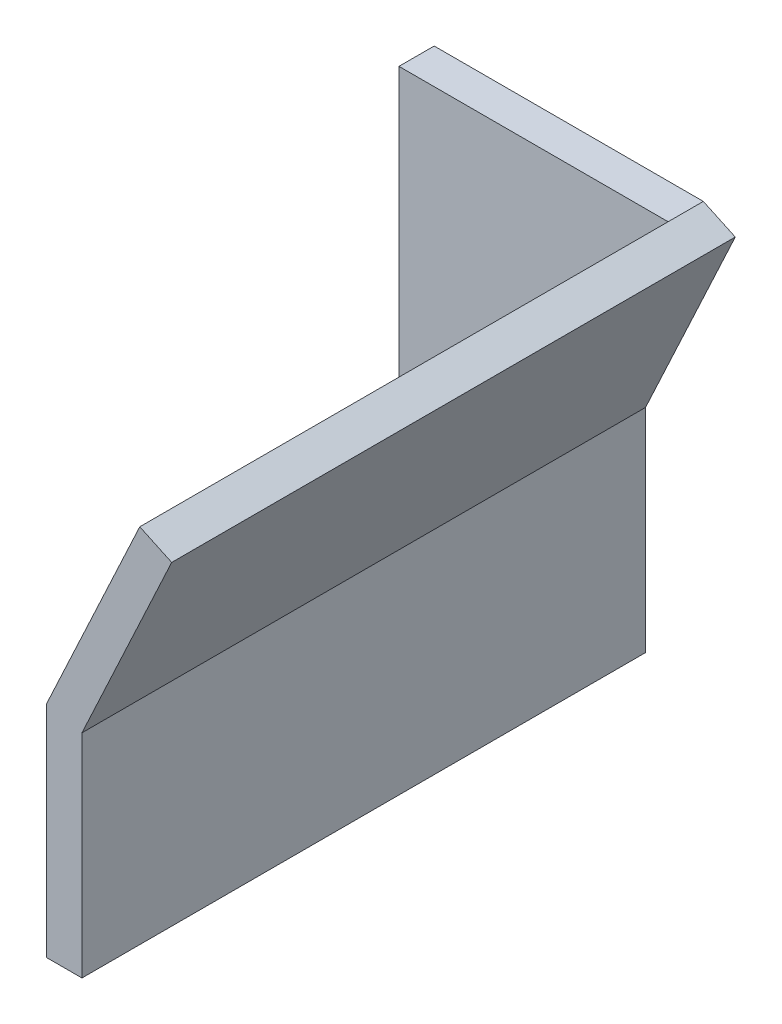
ISO-10303-21;
HEADER;
FILE_DESCRIPTION(('STEP AP214'),'2;1');
FILE_NAME('part.step','',(''),(''),'','','');
FILE_SCHEMA(('AUTOMOTIVE_DESIGN { 1 0 10303 214 1 1 1 1 }'));
ENDSEC;
DATA;
#1=APPLICATION_CONTEXT('core data for automotive mechanical design processes');
#2=APPLICATION_PROTOCOL_DEFINITION('international standard','automotive_design',2000,#1);
#3=PRODUCT_CONTEXT('',#1,'mechanical');
#4=PRODUCT('Part','Part','',(#3));
#5=PRODUCT_RELATED_PRODUCT_CATEGORY('part','',(#4));
#6=PRODUCT_DEFINITION_FORMATION('','',#4);
#7=PRODUCT_DEFINITION_CONTEXT('part definition',#1,'design');
#8=PRODUCT_DEFINITION('design','',#6,#7);
#9=PRODUCT_DEFINITION_SHAPE('','',#8);
#10=(LENGTH_UNIT() NAMED_UNIT(*) SI_UNIT(.MILLI.,.METRE.));
#11=(NAMED_UNIT(*) PLANE_ANGLE_UNIT() SI_UNIT($,.RADIAN.));
#12=(NAMED_UNIT(*) SI_UNIT($,.STERADIAN.) SOLID_ANGLE_UNIT());
#13=UNCERTAINTY_MEASURE_WITH_UNIT(LENGTH_MEASURE(1.E-05),#10,'distance_accuracy_value','');
#14=(GEOMETRIC_REPRESENTATION_CONTEXT(3) GLOBAL_UNCERTAINTY_ASSIGNED_CONTEXT((#13)) GLOBAL_UNIT_ASSIGNED_CONTEXT((#10,
#11,#12)) REPRESENTATION_CONTEXT('',''));
#15=CARTESIAN_POINT('',(0.,0.,0.));
#16=DIRECTION('',(0.,0.,1.));
#17=DIRECTION('',(1.,0.,0.));
#18=AXIS2_PLACEMENT_3D('',#15,#16,#17);
#19=CARTESIAN_POINT('',(0.,0.,60.));
#20=DIRECTION('',(1.,0.,0.));
#21=DIRECTION('',(0.,1.,0.));
#22=AXIS2_PLACEMENT_3D('',#19,#20,#21);
#23=PLANE('',#22);
#24=DIRECTION('',(0.,-1.,0.));
#25=VECTOR('',#24,1.);
#26=CARTESIAN_POINT('',(0.,0.,-60.));
#27=LINE('',#26,#25);
#28=CARTESIAN_POINT('',(0.,0.,-60.));
#29=VERTEX_POINT('',#28);
#30=CARTESIAN_POINT('',(0.,-50.,-60.));
#31=VERTEX_POINT('',#30);
#32=EDGE_CURVE('E172',#29,#31,#27,.T.);
#33=ORIENTED_EDGE('',*,*,#32,.T.);
#34=DIRECTION('',(0.,0.,-1.));
#35=VECTOR('',#34,1.);
#36=CARTESIAN_POINT('',(0.,-50.,60.));
#37=LINE('',#36,#35);
#38=CARTESIAN_POINT('',(0.,-50.,60.));
#39=VERTEX_POINT('',#38);
#40=EDGE_CURVE('E11',#39,#31,#37,.T.);
#41=ORIENTED_EDGE('',*,*,#40,.F.);
#42=DIRECTION('',(0.,-1.,0.));
#43=VECTOR('',#42,1.);
#44=CARTESIAN_POINT('',(0.,0.,60.));
#45=LINE('',#44,#43);
#46=CARTESIAN_POINT('',(0.,0.,60.));
#47=VERTEX_POINT('',#46);
#48=EDGE_CURVE('E173',#47,#39,#45,.T.);
#49=ORIENTED_EDGE('',*,*,#48,.F.);
#50=DIRECTION('',(0.,0.,-1.));
#51=VECTOR('',#50,1.);
#52=CARTESIAN_POINT('',(0.,0.,60.));
#53=LINE('',#52,#51);
#54=EDGE_CURVE('E190',#47,#29,#53,.T.);
#55=ORIENTED_EDGE('',*,*,#54,.T.);
#56=EDGE_LOOP('',(#33,#41,#49,#55));
#57=FACE_BOUND('',#56,.T.);
#58=ADVANCED_FACE('F47',(#57),#23,.F.);
#59=CARTESIAN_POINT('',(0.,-50.,60.));
#60=DIRECTION('',(0.,1.,0.));
#61=DIRECTION('',(0.,0.,1.));
#62=AXIS2_PLACEMENT_3D('',#59,#60,#61);
#63=PLANE('',#62);
#64=ORIENTED_EDGE('',*,*,#40,.T.);
#65=DIRECTION('',(-1.,0.,0.));
#66=VECTOR('',#65,1.);
#67=CARTESIAN_POINT('',(0.,-50.,-60.));
#68=LINE('',#67,#66);
#69=CARTESIAN_POINT('',(-40.,-50.,-60.));
#70=VERTEX_POINT('',#69);
#71=EDGE_CURVE('E156',#31,#70,#68,.T.);
#72=ORIENTED_EDGE('',*,*,#71,.T.);
#73=DIRECTION('',(0.,0.,1.));
#74=VECTOR('',#73,1.);
#75=CARTESIAN_POINT('',(-40.,-50.,-68.));
#76=LINE('',#75,#74);
#77=CARTESIAN_POINT('',(-40.,-50.,-68.));
#78=VERTEX_POINT('',#77);
#79=EDGE_CURVE('E168',#78,#70,#76,.T.);
#80=ORIENTED_EDGE('',*,*,#79,.F.);
#81=DIRECTION('',(-1.,0.,0.));
#82=VECTOR('',#81,1.);
#83=CARTESIAN_POINT('',(8.00000000000001,-50.,-68.));
#84=LINE('',#83,#82);
#85=CARTESIAN_POINT('',(8.00000000000001,-50.,-68.));
#86=VERTEX_POINT('',#85);
#87=EDGE_CURVE('E131',#86,#78,#84,.T.);
#88=ORIENTED_EDGE('',*,*,#87,.F.);
#89=DIRECTION('',(0.,0.,-1.));
#90=VECTOR('',#89,1.);
#91=CARTESIAN_POINT('',(8.00000000000001,-50.,60.));
#92=LINE('',#91,#90);
#93=CARTESIAN_POINT('',(8.00000000000001,-50.,60.));
#94=VERTEX_POINT('',#93);
#95=EDGE_CURVE('E56',#94,#86,#92,.T.);
#96=ORIENTED_EDGE('',*,*,#95,.F.);
#97=DIRECTION('',(1.,0.,0.));
#98=VECTOR('',#97,1.);
#99=CARTESIAN_POINT('',(0.,-50.,60.));
#100=LINE('',#99,#98);
#101=EDGE_CURVE('E176',#39,#94,#100,.T.);
#102=ORIENTED_EDGE('',*,*,#101,.F.);
#103=EDGE_LOOP('',(#64,#72,#80,#88,#96,#102));
#104=FACE_BOUND('',#103,.T.);
#105=ADVANCED_FACE('F214',(#104),#63,.F.);
#106=CARTESIAN_POINT('',(8.,-1.77355730114349,60.));
#107=DIRECTION('',(-1.,0.,0.));
#108=DIRECTION('',(0.,-1.,0.));
#109=AXIS2_PLACEMENT_3D('',#106,#107,#108);
#110=PLANE('',#109);
#111=ORIENTED_EDGE('',*,*,#95,.T.);
#112=DIRECTION('',(0.,-1.,0.));
#113=VECTOR('',#112,1.);
#114=CARTESIAN_POINT('',(8.,-1.77355730114349,-68.));
#115=LINE('',#114,#113);
#116=CARTESIAN_POINT('',(8.,-1.77355730114349,-68.));
#117=VERTEX_POINT('',#116);
#118=EDGE_CURVE('E125',#117,#86,#115,.T.);
#119=ORIENTED_EDGE('',*,*,#118,.F.);
#120=DIRECTION('',(0.,0.,-1.));
#121=VECTOR('',#120,1.);
#122=CARTESIAN_POINT('',(8.,-1.77355730114349,60.));
#123=LINE('',#122,#121);
#124=CARTESIAN_POINT('',(8.,-1.77355730114349,60.));
#125=VERTEX_POINT('',#124);
#126=EDGE_CURVE('E112',#125,#117,#123,.T.);
#127=ORIENTED_EDGE('',*,*,#126,.F.);
#128=DIRECTION('',(0.,1.,0.));
#129=VECTOR('',#128,1.);
#130=CARTESIAN_POINT('',(8.,-1.77355730114349,60.));
#131=LINE('',#130,#129);
#132=EDGE_CURVE('E180',#94,#125,#131,.T.);
#133=ORIENTED_EDGE('',*,*,#132,.F.);
#134=EDGE_LOOP('',(#111,#119,#127,#133));
#135=FACE_BOUND('',#134,.T.);
#136=ADVANCED_FACE('F126',(#135),#110,.F.);
#137=CARTESIAN_POINT('',(8.,-1.77355730114349,60.));
#138=DIRECTION('',(-0.906307787036653,0.422618261740694,0.));
#139=DIRECTION('',(-0.422618261740694,-0.906307787036653,0.));
#140=AXIS2_PLACEMENT_3D('',#137,#138,#139);
#141=PLANE('',#140);
#142=ORIENTED_EDGE('',*,*,#126,.T.);
#143=DIRECTION('',(-0.422618261740694,-0.906307787036653,0.));
#144=VECTOR('',#143,1.);
#145=CARTESIAN_POINT('',(28.3813753833279,41.9344432579071,-68.));
#146=LINE('',#145,#144);
#147=CARTESIAN_POINT('',(28.3813753833279,41.9344432579071,-68.));
#148=VERTEX_POINT('',#147);
#149=EDGE_CURVE('E117',#148,#117,#146,.T.);
#150=ORIENTED_EDGE('',*,*,#149,.F.);
#151=DIRECTION('',(0.,0.,-1.));
#152=VECTOR('',#151,1.);
#153=CARTESIAN_POINT('',(28.3813753833279,41.9344432579071,60.));
#154=LINE('',#153,#152);
#155=CARTESIAN_POINT('',(28.3813753833279,41.9344432579071,60.));
#156=VERTEX_POINT('',#155);
#157=EDGE_CURVE('E122',#156,#148,#154,.T.);
#158=ORIENTED_EDGE('',*,*,#157,.F.);
#159=DIRECTION('',(0.422618261740694,0.906307787036653,0.));
#160=VECTOR('',#159,1.);
#161=CARTESIAN_POINT('',(8.,-1.77355730114349,60.));
#162=LINE('',#161,#160);
#163=EDGE_CURVE('E118',#125,#156,#162,.T.);
#164=ORIENTED_EDGE('',*,*,#163,.F.);
#165=EDGE_LOOP('',(#142,#150,#158,#164));
#166=FACE_BOUND('',#165,.T.);
#167=ADVANCED_FACE('F114',(#166),#141,.F.);
#168=CARTESIAN_POINT('',(21.1309130870347,45.3153893518326,60.));
#169=DIRECTION('',(-0.422618261740694,-0.906307787036653,0.));
#170=DIRECTION('',(0.906307787036653,-0.422618261740694,0.));
#171=AXIS2_PLACEMENT_3D('',#168,#169,#170);
#172=PLANE('',#171);
#173=ORIENTED_EDGE('',*,*,#157,.T.);
#174=DIRECTION('',(0.906307787036653,-0.422618261740694,0.));
#175=VECTOR('',#174,1.);
#176=CARTESIAN_POINT('',(28.3813753833279,41.9344432579071,-68.));
#177=LINE('',#176,#175);
#178=CARTESIAN_POINT('',(21.1309130870347,45.3153893518326,-68.));
#179=VERTEX_POINT('',#178);
#180=EDGE_CURVE('E136',#179,#148,#177,.T.);
#181=ORIENTED_EDGE('',*,*,#180,.F.);
#182=DIRECTION('',(0.,0.,1.));
#183=VECTOR('',#182,1.);
#184=CARTESIAN_POINT('',(21.1309130870347,45.3153893518326,-68.));
#185=LINE('',#184,#183);
#186=CARTESIAN_POINT('',(21.1309130870347,45.3153893518326,-60.));
#187=VERTEX_POINT('',#186);
#188=EDGE_CURVE('E155',#179,#187,#185,.T.);
#189=ORIENTED_EDGE('',*,*,#188,.T.);
#190=DIRECTION('',(0.,0.,-1.));
#191=VECTOR('',#190,1.);
#192=CARTESIAN_POINT('',(21.1309130870347,45.3153893518326,60.));
#193=LINE('',#192,#191);
#194=CARTESIAN_POINT('',(21.1309130870347,45.3153893518326,60.));
#195=VERTEX_POINT('',#194);
#196=EDGE_CURVE('E200',#195,#187,#193,.T.);
#197=ORIENTED_EDGE('',*,*,#196,.F.);
#198=DIRECTION('',(-0.906307787036653,0.422618261740694,0.));
#199=VECTOR('',#198,1.);
#200=CARTESIAN_POINT('',(21.1309130870347,45.3153893518326,60.));
#201=LINE('',#200,#199);
#202=EDGE_CURVE('E185',#156,#195,#201,.T.);
#203=ORIENTED_EDGE('',*,*,#202,.F.);
#204=EDGE_LOOP('',(#173,#181,#189,#197,#203));
#205=FACE_BOUND('',#204,.T.);
#206=ADVANCED_FACE('F208',(#205),#172,.F.);
#207=CARTESIAN_POINT('',(0.,0.,60.));
#208=DIRECTION('',(0.906307787036653,-0.422618261740694,0.));
#209=DIRECTION('',(0.422618261740694,0.906307787036653,0.));
#210=AXIS2_PLACEMENT_3D('',#207,#208,#209);
#211=PLANE('',#210);
#212=DIRECTION('',(-0.422618261740694,-0.906307787036653,0.));
#213=VECTOR('',#212,1.);
#214=CARTESIAN_POINT('',(0.,0.,-60.));
#215=LINE('',#214,#213);
#216=EDGE_CURVE('E177',#187,#29,#215,.T.);
#217=ORIENTED_EDGE('',*,*,#216,.T.);
#218=ORIENTED_EDGE('',*,*,#54,.F.);
#219=DIRECTION('',(-0.422618261740694,-0.906307787036653,0.));
#220=VECTOR('',#219,1.);
#221=CARTESIAN_POINT('',(0.,0.,60.));
#222=LINE('',#221,#220);
#223=EDGE_CURVE('E63',#195,#47,#222,.T.);
#224=ORIENTED_EDGE('',*,*,#223,.F.);
#225=ORIENTED_EDGE('',*,*,#196,.T.);
#226=EDGE_LOOP('',(#217,#218,#224,#225));
#227=FACE_BOUND('',#226,.T.);
#228=ADVANCED_FACE('F227',(#227),#211,.F.);
#229=CARTESIAN_POINT('',(0.,0.,60.));
#230=DIRECTION('',(0.,0.,1.));
#231=DIRECTION('',(1.,0.,0.));
#232=AXIS2_PLACEMENT_3D('',#229,#230,#231);
#233=PLANE('',#232);
#234=ORIENTED_EDGE('',*,*,#48,.T.);
#235=ORIENTED_EDGE('',*,*,#101,.T.);
#236=ORIENTED_EDGE('',*,*,#132,.T.);
#237=ORIENTED_EDGE('',*,*,#163,.T.);
#238=ORIENTED_EDGE('',*,*,#202,.T.);
#239=ORIENTED_EDGE('',*,*,#223,.T.);
#240=EDGE_LOOP('',(#234,#235,#236,#237,#238,#239));
#241=FACE_BOUND('',#240,.T.);
#242=ADVANCED_FACE('F210',(#241),#233,.T.);
#243=CARTESIAN_POINT('',(-40.,-50.,-68.));
#244=DIRECTION('',(1.,0.,0.));
#245=DIRECTION('',(0.,0.,-1.));
#246=AXIS2_PLACEMENT_3D('',#243,#244,#245);
#247=PLANE('',#246);
#248=DIRECTION('',(0.,1.,0.));
#249=VECTOR('',#248,1.);
#250=CARTESIAN_POINT('',(-40.,-50.,-60.));
#251=LINE('',#250,#249);
#252=CARTESIAN_POINT('',(-40.,45.3153893518326,-60.));
#253=VERTEX_POINT('',#252);
#254=EDGE_CURVE('E142',#70,#253,#251,.T.);
#255=ORIENTED_EDGE('',*,*,#254,.T.);
#256=DIRECTION('',(0.,0.,1.));
#257=VECTOR('',#256,1.);
#258=CARTESIAN_POINT('',(-40.,45.3153893518326,-68.));
#259=LINE('',#258,#257);
#260=CARTESIAN_POINT('',(-40.,45.3153893518326,-68.));
#261=VERTEX_POINT('',#260);
#262=EDGE_CURVE('E164',#261,#253,#259,.T.);
#263=ORIENTED_EDGE('',*,*,#262,.F.);
#264=DIRECTION('',(0.,1.,0.));
#265=VECTOR('',#264,1.);
#266=CARTESIAN_POINT('',(-40.,-50.,-68.));
#267=LINE('',#266,#265);
#268=EDGE_CURVE('E147',#78,#261,#267,.T.);
#269=ORIENTED_EDGE('',*,*,#268,.F.);
#270=ORIENTED_EDGE('',*,*,#79,.T.);
#271=EDGE_LOOP('',(#255,#263,#269,#270));
#272=FACE_BOUND('',#271,.T.);
#273=ADVANCED_FACE('F221',(#272),#247,.F.);
#274=CARTESIAN_POINT('',(-40.,45.3153893518326,-68.));
#275=DIRECTION('',(0.,-1.,0.));
#276=DIRECTION('',(1.,0.,0.));
#277=AXIS2_PLACEMENT_3D('',#274,#275,#276);
#278=PLANE('',#277);
#279=DIRECTION('',(1.,0.,0.));
#280=VECTOR('',#279,1.);
#281=CARTESIAN_POINT('',(-40.,45.3153893518326,-60.));
#282=LINE('',#281,#280);
#283=EDGE_CURVE('E138',#253,#187,#282,.T.);
#284=ORIENTED_EDGE('',*,*,#283,.T.);
#285=ORIENTED_EDGE('',*,*,#188,.F.);
#286=DIRECTION('',(1.,0.,0.));
#287=VECTOR('',#286,1.);
#288=CARTESIAN_POINT('',(-40.,45.3153893518326,-68.));
#289=LINE('',#288,#287);
#290=EDGE_CURVE('E150',#261,#179,#289,.T.);
#291=ORIENTED_EDGE('',*,*,#290,.F.);
#292=ORIENTED_EDGE('',*,*,#262,.T.);
#293=EDGE_LOOP('',(#284,#285,#291,#292));
#294=FACE_BOUND('',#293,.T.);
#295=ADVANCED_FACE('F225',(#294),#278,.F.);
#296=CARTESIAN_POINT('',(0.,0.,-68.));
#297=DIRECTION('',(0.,0.,-1.));
#298=DIRECTION('',(-1.,0.,0.));
#299=AXIS2_PLACEMENT_3D('',#296,#297,#298);
#300=PLANE('',#299);
#301=ORIENTED_EDGE('',*,*,#149,.T.);
#302=ORIENTED_EDGE('',*,*,#118,.T.);
#303=ORIENTED_EDGE('',*,*,#87,.T.);
#304=ORIENTED_EDGE('',*,*,#268,.T.);
#305=ORIENTED_EDGE('',*,*,#290,.T.);
#306=ORIENTED_EDGE('',*,*,#180,.T.);
#307=EDGE_LOOP('',(#301,#302,#303,#304,#305,#306));
#308=FACE_BOUND('',#307,.T.);
#309=ADVANCED_FACE('F134',(#308),#300,.T.);
#310=CARTESIAN_POINT('',(0.,0.,-60.));
#311=DIRECTION('',(0.,0.,-1.));
#312=DIRECTION('',(-1.,0.,0.));
#313=AXIS2_PLACEMENT_3D('',#310,#311,#312);
#314=PLANE('',#313);
#315=ORIENTED_EDGE('',*,*,#32,.F.);
#316=ORIENTED_EDGE('',*,*,#216,.F.);
#317=ORIENTED_EDGE('',*,*,#283,.F.);
#318=ORIENTED_EDGE('',*,*,#254,.F.);
#319=ORIENTED_EDGE('',*,*,#71,.F.);
#320=EDGE_LOOP('',(#315,#316,#317,#318,#319));
#321=FACE_BOUND('',#320,.T.);
#322=ADVANCED_FACE('F231',(#321),#314,.F.);
#323=CLOSED_SHELL('',(#58,#105,#136,#167,#206,#228,#242,#273,#295,#309,#322));
#324=MANIFOLD_SOLID_BREP('B2',#323);
#325=ADVANCED_BREP_SHAPE_REPRESENTATION('',(#18,#324),#14);
#326=SHAPE_DEFINITION_REPRESENTATION(#9,#325);
ENDSEC;
END-ISO-10303-21;
